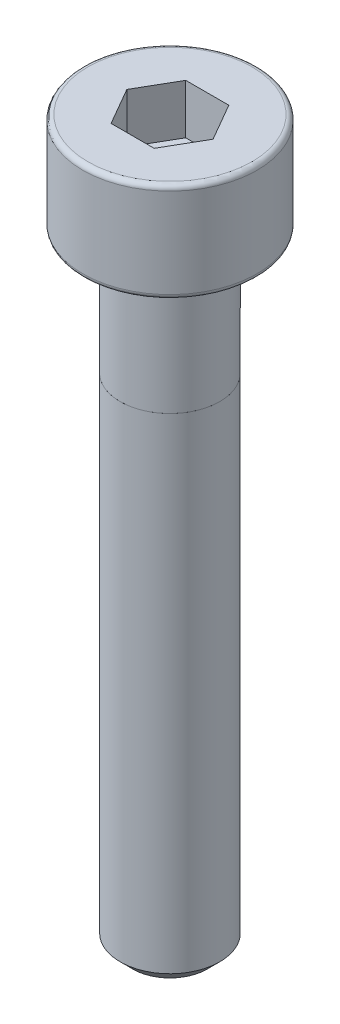
ISO-10303-21;
HEADER;
FILE_DESCRIPTION(('STEP AP214'),'2;1');
FILE_NAME('part.step','',(''),(''),'','','');
FILE_SCHEMA(('AUTOMOTIVE_DESIGN { 1 0 10303 214 1 1 1 1 }'));
ENDSEC;
DATA;
#1=APPLICATION_CONTEXT('core data for automotive mechanical design processes');
#2=APPLICATION_PROTOCOL_DEFINITION('international standard','automotive_design',2000,#1);
#3=PRODUCT_CONTEXT('',#1,'mechanical');
#4=PRODUCT('Part','Part','',(#3));
#5=PRODUCT_RELATED_PRODUCT_CATEGORY('part','',(#4));
#6=PRODUCT_DEFINITION_FORMATION('','',#4);
#7=PRODUCT_DEFINITION_CONTEXT('part definition',#1,'design');
#8=PRODUCT_DEFINITION('design','',#6,#7);
#9=PRODUCT_DEFINITION_SHAPE('','',#8);
#10=(LENGTH_UNIT() NAMED_UNIT(*) SI_UNIT(.MILLI.,.METRE.));
#11=(NAMED_UNIT(*) PLANE_ANGLE_UNIT() SI_UNIT($,.RADIAN.));
#12=(NAMED_UNIT(*) SI_UNIT($,.STERADIAN.) SOLID_ANGLE_UNIT());
#13=UNCERTAINTY_MEASURE_WITH_UNIT(LENGTH_MEASURE(1.E-05),#10,'distance_accuracy_value','');
#14=(GEOMETRIC_REPRESENTATION_CONTEXT(3) GLOBAL_UNCERTAINTY_ASSIGNED_CONTEXT((#13)) GLOBAL_UNIT_ASSIGNED_CONTEXT((#10,
#11,#12)) REPRESENTATION_CONTEXT('',''));
#15=CARTESIAN_POINT('',(0.,0.,0.));
#16=DIRECTION('',(0.,0.,1.));
#17=DIRECTION('',(1.,0.,0.));
#18=AXIS2_PLACEMENT_3D('',#15,#16,#17);
#19=CARTESIAN_POINT('',(0.,-29.,0.));
#20=DIRECTION('',(0.,1.,0.));
#21=DIRECTION('',(0.,0.,1.));
#22=AXIS2_PLACEMENT_3D('',#19,#20,#21);
#23=CYLINDRICAL_SURFACE('',#22,2.);
#24=CARTESIAN_POINT('',(0.,-28.5,0.));
#25=DIRECTION('',(0.,-1.,0.));
#26=DIRECTION('',(0.,0.,-1.));
#27=AXIS2_PLACEMENT_3D('',#24,#25,#26);
#28=CIRCLE('',#27,2.);
#29=CARTESIAN_POINT('',(0.,-28.5,-2.));
#30=VERTEX_POINT('',#29);
#31=EDGE_CURVE('E11',#30,#30,#28,.F.);
#32=ORIENTED_EDGE('',*,*,#31,.T.);
#33=EDGE_LOOP('',(#32));
#34=FACE_BOUND('',#33,.T.);
#35=CARTESIAN_POINT('',(0.,-9.,0.));
#36=DIRECTION('',(0.,-1.,0.));
#37=DIRECTION('',(0.,0.,-1.));
#38=AXIS2_PLACEMENT_3D('',#35,#36,#37);
#39=CIRCLE('',#38,2.);
#40=CARTESIAN_POINT('',(0.,-9.,-2.));
#41=VERTEX_POINT('',#40);
#42=EDGE_CURVE('E53',#41,#41,#39,.T.);
#43=ORIENTED_EDGE('',*,*,#42,.T.);
#44=EDGE_LOOP('',(#43));
#45=FACE_BOUND('',#44,.T.);
#46=ADVANCED_FACE('F42',(#34,#45),#23,.T.);
#47=CARTESIAN_POINT('',(0.,-29.,0.));
#48=DIRECTION('',(0.,-1.,0.));
#49=DIRECTION('',(0.,0.,-1.));
#50=AXIS2_PLACEMENT_3D('',#47,#48,#49);
#51=PLANE('',#50);
#52=CARTESIAN_POINT('',(0.,-29.,0.));
#53=DIRECTION('',(0.,-1.,0.));
#54=DIRECTION('',(0.,0.,-1.));
#55=AXIS2_PLACEMENT_3D('',#52,#53,#54);
#56=CIRCLE('',#55,1.5);
#57=CARTESIAN_POINT('',(0.,-29.,-1.5));
#58=VERTEX_POINT('',#57);
#59=EDGE_CURVE('E49',#58,#58,#56,.T.);
#60=ORIENTED_EDGE('',*,*,#59,.T.);
#61=EDGE_LOOP('',(#60));
#62=FACE_BOUND('',#61,.T.);
#63=ADVANCED_FACE('F63',(#62),#51,.T.);
#64=CARTESIAN_POINT('',(0.,-9.,0.));
#65=DIRECTION('',(0.,-1.,0.));
#66=DIRECTION('',(0.,0.,-1.));
#67=AXIS2_PLACEMENT_3D('',#64,#65,#66);
#68=PLANE('',#67);
#69=ORIENTED_EDGE('',*,*,#42,.F.);
#70=EDGE_LOOP('',(#69));
#71=FACE_BOUND('',#70,.T.);
#72=ADVANCED_FACE('F61',(#71),#68,.F.);
#73=CARTESIAN_POINT('',(0.,-29.,0.));
#74=DIRECTION('',(0.,1.,0.));
#75=DIRECTION('',(0.,0.,1.));
#76=AXIS2_PLACEMENT_3D('',#73,#74,#75);
#77=CONICAL_SURFACE('',#76,1.5,0.785398163397443);
#78=ORIENTED_EDGE('',*,*,#31,.F.);
#79=EDGE_LOOP('',(#78));
#80=FACE_BOUND('',#79,.T.);
#81=ORIENTED_EDGE('',*,*,#59,.F.);
#82=EDGE_LOOP('',(#81));
#83=FACE_BOUND('',#82,.T.);
#84=ADVANCED_FACE('F44',(#80,#83),#77,.T.);
#85=CLOSED_SHELL('',(#46,#63,#72,#84));
#86=MANIFOLD_SOLID_BREP('B2',#85);
#87=CARTESIAN_POINT('',(0.,-4.,0.));
#88=DIRECTION('',(0.,1.,0.));
#89=DIRECTION('',(0.,0.,1.));
#90=AXIS2_PLACEMENT_3D('',#87,#88,#89);
#91=CYLINDRICAL_SURFACE('',#90,3.5);
#92=CARTESIAN_POINT('',(0.,-3.8,0.));
#93=DIRECTION('',(0.,1.,0.));
#94=DIRECTION('',(0.,0.,1.));
#95=AXIS2_PLACEMENT_3D('',#92,#93,#94);
#96=CIRCLE('',#95,3.5);
#97=CARTESIAN_POINT('',(0.,-3.8,3.5));
#98=VERTEX_POINT('',#97);
#99=EDGE_CURVE('E217',#98,#98,#96,.T.);
#100=ORIENTED_EDGE('',*,*,#99,.T.);
#101=EDGE_LOOP('',(#100));
#102=FACE_BOUND('',#101,.T.);
#103=CARTESIAN_POINT('',(0.,-0.2,0.));
#104=DIRECTION('',(0.,1.,0.));
#105=DIRECTION('',(0.,0.,1.));
#106=AXIS2_PLACEMENT_3D('',#103,#104,#105);
#107=CIRCLE('',#106,3.5);
#108=CARTESIAN_POINT('',(0.,-0.2,3.5));
#109=VERTEX_POINT('',#108);
#110=EDGE_CURVE('E214',#109,#109,#107,.F.);
#111=ORIENTED_EDGE('',*,*,#110,.T.);
#112=EDGE_LOOP('',(#111));
#113=FACE_BOUND('',#112,.T.);
#114=ADVANCED_FACE('F103',(#102,#113),#91,.T.);
#115=CARTESIAN_POINT('',(0.,-4.,0.));
#116=DIRECTION('',(0.,1.,0.));
#117=DIRECTION('',(0.,0.,1.));
#118=AXIS2_PLACEMENT_3D('',#115,#116,#117);
#119=PLANE('',#118);
#120=CARTESIAN_POINT('',(0.,-4.,0.));
#121=DIRECTION('',(0.,1.,0.));
#122=DIRECTION('',(0.,0.,1.));
#123=AXIS2_PLACEMENT_3D('',#120,#121,#122);
#124=CIRCLE('',#123,3.3);
#125=CARTESIAN_POINT('',(0.,-4.,3.3));
#126=VERTEX_POINT('',#125);
#127=EDGE_CURVE('E111',#126,#126,#124,.F.);
#128=ORIENTED_EDGE('',*,*,#127,.T.);
#129=EDGE_LOOP('',(#128));
#130=FACE_BOUND('',#129,.T.);
#131=CARTESIAN_POINT('',(0.,-4.,0.));
#132=DIRECTION('',(0.,1.,0.));
#133=DIRECTION('',(0.,0.,1.));
#134=AXIS2_PLACEMENT_3D('',#131,#132,#133);
#135=CIRCLE('',#134,2.);
#136=CARTESIAN_POINT('',(0.,-4.,2.));
#137=VERTEX_POINT('',#136);
#138=EDGE_CURVE('E206',#137,#137,#135,.F.);
#139=ORIENTED_EDGE('',*,*,#138,.F.);
#140=EDGE_LOOP('',(#139));
#141=FACE_BOUND('',#140,.T.);
#142=ADVANCED_FACE('F222',(#130,#141),#119,.F.);
#143=CARTESIAN_POINT('',(0.,0.,0.));
#144=DIRECTION('',(0.,1.,0.));
#145=DIRECTION('',(0.,0.,1.));
#146=AXIS2_PLACEMENT_3D('',#143,#144,#145);
#147=PLANE('',#146);
#148=CARTESIAN_POINT('',(0.,0.,0.));
#149=DIRECTION('',(0.,1.,0.));
#150=DIRECTION('',(0.,0.,1.));
#151=AXIS2_PLACEMENT_3D('',#148,#149,#150);
#152=CIRCLE('',#151,3.3);
#153=CARTESIAN_POINT('',(0.,0.,3.3));
#154=VERTEX_POINT('',#153);
#155=EDGE_CURVE('E40',#154,#154,#152,.T.);
#156=ORIENTED_EDGE('',*,*,#155,.T.);
#157=EDGE_LOOP('',(#156));
#158=FACE_BOUND('',#157,.T.);
#159=DIRECTION('',(0.499999999999999,0.,-0.866025403784439));
#160=VECTOR('',#159,1.);
#161=CARTESIAN_POINT('',(0.866025403784439,0.,1.5));
#162=LINE('',#161,#160);
#163=CARTESIAN_POINT('',(0.866025403784439,0.,1.5));
#164=VERTEX_POINT('',#163);
#165=CARTESIAN_POINT('',(1.73205080756888,0.,0.));
#166=VERTEX_POINT('',#165);
#167=EDGE_CURVE('E118',#164,#166,#162,.T.);
#168=ORIENTED_EDGE('',*,*,#167,.F.);
#169=DIRECTION('',(1.,0.,0.));
#170=VECTOR('',#169,1.);
#171=CARTESIAN_POINT('',(-0.866025403784439,0.,1.5));
#172=LINE('',#171,#170);
#173=CARTESIAN_POINT('',(-0.866025403784439,0.,1.5));
#174=VERTEX_POINT('',#173);
#175=EDGE_CURVE('E202',#174,#164,#172,.T.);
#176=ORIENTED_EDGE('',*,*,#175,.F.);
#177=DIRECTION('',(0.5,0.,0.866025403784438));
#178=VECTOR('',#177,1.);
#179=CARTESIAN_POINT('',(-1.73205080756888,0.,0.));
#180=LINE('',#179,#178);
#181=CARTESIAN_POINT('',(-1.73205080756888,0.,0.));
#182=VERTEX_POINT('',#181);
#183=EDGE_CURVE('E200',#182,#174,#180,.T.);
#184=ORIENTED_EDGE('',*,*,#183,.F.);
#185=DIRECTION('',(-0.499999999999999,0.,0.866025403784439));
#186=VECTOR('',#185,1.);
#187=CARTESIAN_POINT('',(-0.86602540378444,0.,-1.5));
#188=LINE('',#187,#186);
#189=CARTESIAN_POINT('',(-0.86602540378444,0.,-1.5));
#190=VERTEX_POINT('',#189);
#191=EDGE_CURVE('E166',#190,#182,#188,.T.);
#192=ORIENTED_EDGE('',*,*,#191,.F.);
#193=DIRECTION('',(-1.,0.,0.));
#194=VECTOR('',#193,1.);
#195=CARTESIAN_POINT('',(0.866025403784438,0.,-1.5));
#196=LINE('',#195,#194);
#197=CARTESIAN_POINT('',(0.866025403784438,0.,-1.5));
#198=VERTEX_POINT('',#197);
#199=EDGE_CURVE('E196',#198,#190,#196,.T.);
#200=ORIENTED_EDGE('',*,*,#199,.F.);
#201=DIRECTION('',(-0.5,0.,-0.866025403784438));
#202=VECTOR('',#201,1.);
#203=CARTESIAN_POINT('',(1.73205080756888,0.,0.));
#204=LINE('',#203,#202);
#205=EDGE_CURVE('E192',#166,#198,#204,.T.);
#206=ORIENTED_EDGE('',*,*,#205,.F.);
#207=EDGE_LOOP('',(#168,#176,#184,#192,#200,#206));
#208=FACE_BOUND('',#207,.T.);
#209=ADVANCED_FACE('F240',(#158,#208),#147,.T.);
#210=CARTESIAN_POINT('',(0.866025403784439,-2.,1.5));
#211=DIRECTION('',(0.866025403784439,0.,0.499999999999999));
#212=DIRECTION('',(0.499999999999999,0.,-0.866025403784439));
#213=AXIS2_PLACEMENT_3D('',#210,#211,#212);
#214=PLANE('',#213);
#215=ORIENTED_EDGE('',*,*,#167,.T.);
#216=DIRECTION('',(0.,1.,0.));
#217=VECTOR('',#216,1.);
#218=CARTESIAN_POINT('',(1.73205080756888,-2.,0.));
#219=LINE('',#218,#217);
#220=CARTESIAN_POINT('',(1.73205080756888,-2.,0.));
#221=VERTEX_POINT('',#220);
#222=EDGE_CURVE('E148',#221,#166,#219,.T.);
#223=ORIENTED_EDGE('',*,*,#222,.F.);
#224=DIRECTION('',(0.499999999999999,0.,-0.866025403784439));
#225=VECTOR('',#224,1.);
#226=CARTESIAN_POINT('',(0.866025403784439,-2.,1.5));
#227=LINE('',#226,#225);
#228=CARTESIAN_POINT('',(0.866025403784439,-2.,1.5));
#229=VERTEX_POINT('',#228);
#230=EDGE_CURVE('E204',#229,#221,#227,.T.);
#231=ORIENTED_EDGE('',*,*,#230,.F.);
#232=DIRECTION('',(0.,1.,0.));
#233=VECTOR('',#232,1.);
#234=CARTESIAN_POINT('',(0.866025403784439,-2.,1.5));
#235=LINE('',#234,#233);
#236=EDGE_CURVE('E126',#229,#164,#235,.T.);
#237=ORIENTED_EDGE('',*,*,#236,.T.);
#238=EDGE_LOOP('',(#215,#223,#231,#237));
#239=FACE_BOUND('',#238,.T.);
#240=ADVANCED_FACE('F243',(#239),#214,.F.);
#241=CARTESIAN_POINT('',(-0.866025403784439,-2.,1.5));
#242=DIRECTION('',(0.,0.,1.));
#243=DIRECTION('',(1.,0.,0.));
#244=AXIS2_PLACEMENT_3D('',#241,#242,#243);
#245=PLANE('',#244);
#246=ORIENTED_EDGE('',*,*,#175,.T.);
#247=ORIENTED_EDGE('',*,*,#236,.F.);
#248=DIRECTION('',(1.,0.,0.));
#249=VECTOR('',#248,1.);
#250=CARTESIAN_POINT('',(-0.866025403784439,-2.,1.5));
#251=LINE('',#250,#249);
#252=CARTESIAN_POINT('',(-0.866025403784439,-2.,1.5));
#253=VERTEX_POINT('',#252);
#254=EDGE_CURVE('E178',#253,#229,#251,.T.);
#255=ORIENTED_EDGE('',*,*,#254,.F.);
#256=DIRECTION('',(0.,1.,0.));
#257=VECTOR('',#256,1.);
#258=CARTESIAN_POINT('',(-0.866025403784439,-2.,1.5));
#259=LINE('',#258,#257);
#260=EDGE_CURVE('E170',#253,#174,#259,.T.);
#261=ORIENTED_EDGE('',*,*,#260,.T.);
#262=EDGE_LOOP('',(#246,#247,#255,#261));
#263=FACE_BOUND('',#262,.T.);
#264=ADVANCED_FACE('F268',(#263),#245,.F.);
#265=CARTESIAN_POINT('',(-1.73205080756888,-2.,0.));
#266=DIRECTION('',(-0.866025403784439,0.,0.5));
#267=DIRECTION('',(0.5,0.,0.866025403784438));
#268=AXIS2_PLACEMENT_3D('',#265,#266,#267);
#269=PLANE('',#268);
#270=ORIENTED_EDGE('',*,*,#183,.T.);
#271=ORIENTED_EDGE('',*,*,#260,.F.);
#272=DIRECTION('',(0.5,0.,0.866025403784438));
#273=VECTOR('',#272,1.);
#274=CARTESIAN_POINT('',(-1.73205080756888,-2.,0.));
#275=LINE('',#274,#273);
#276=CARTESIAN_POINT('',(-1.73205080756888,-2.,0.));
#277=VERTEX_POINT('',#276);
#278=EDGE_CURVE('E174',#277,#253,#275,.T.);
#279=ORIENTED_EDGE('',*,*,#278,.F.);
#280=DIRECTION('',(0.,1.,0.));
#281=VECTOR('',#280,1.);
#282=CARTESIAN_POINT('',(-1.73205080756888,-2.,0.));
#283=LINE('',#282,#281);
#284=EDGE_CURVE('E159',#277,#182,#283,.T.);
#285=ORIENTED_EDGE('',*,*,#284,.T.);
#286=EDGE_LOOP('',(#270,#271,#279,#285));
#287=FACE_BOUND('',#286,.T.);
#288=ADVANCED_FACE('F175',(#287),#269,.F.);
#289=CARTESIAN_POINT('',(-0.86602540378444,-2.,-1.5));
#290=DIRECTION('',(-0.866025403784439,0.,-0.5));
#291=DIRECTION('',(-0.5,0.,0.866025403784439));
#292=AXIS2_PLACEMENT_3D('',#289,#290,#291);
#293=PLANE('',#292);
#294=ORIENTED_EDGE('',*,*,#191,.T.);
#295=ORIENTED_EDGE('',*,*,#284,.F.);
#296=DIRECTION('',(-0.499999999999999,0.,0.866025403784439));
#297=VECTOR('',#296,1.);
#298=CARTESIAN_POINT('',(-0.86602540378444,-2.,-1.5));
#299=LINE('',#298,#297);
#300=CARTESIAN_POINT('',(-0.86602540378444,-2.,-1.5));
#301=VERTEX_POINT('',#300);
#302=EDGE_CURVE('E163',#301,#277,#299,.T.);
#303=ORIENTED_EDGE('',*,*,#302,.F.);
#304=DIRECTION('',(0.,1.,0.));
#305=VECTOR('',#304,1.);
#306=CARTESIAN_POINT('',(-0.86602540378444,-2.,-1.5));
#307=LINE('',#306,#305);
#308=EDGE_CURVE('E171',#301,#190,#307,.T.);
#309=ORIENTED_EDGE('',*,*,#308,.T.);
#310=EDGE_LOOP('',(#294,#295,#303,#309));
#311=FACE_BOUND('',#310,.T.);
#312=ADVANCED_FACE('F161',(#311),#293,.F.);
#313=CARTESIAN_POINT('',(0.866025403784438,-2.,-1.5));
#314=DIRECTION('',(0.,0.,-1.));
#315=DIRECTION('',(-1.,0.,0.));
#316=AXIS2_PLACEMENT_3D('',#313,#314,#315);
#317=PLANE('',#316);
#318=ORIENTED_EDGE('',*,*,#199,.T.);
#319=ORIENTED_EDGE('',*,*,#308,.F.);
#320=DIRECTION('',(-1.,0.,0.));
#321=VECTOR('',#320,1.);
#322=CARTESIAN_POINT('',(0.866025403784438,-2.,-1.5));
#323=LINE('',#322,#321);
#324=CARTESIAN_POINT('',(0.866025403784438,-2.,-1.5));
#325=VERTEX_POINT('',#324);
#326=EDGE_CURVE('E184',#325,#301,#323,.T.);
#327=ORIENTED_EDGE('',*,*,#326,.F.);
#328=DIRECTION('',(0.,1.,0.));
#329=VECTOR('',#328,1.);
#330=CARTESIAN_POINT('',(0.866025403784438,-2.,-1.5));
#331=LINE('',#330,#329);
#332=EDGE_CURVE('E209',#325,#198,#331,.T.);
#333=ORIENTED_EDGE('',*,*,#332,.T.);
#334=EDGE_LOOP('',(#318,#319,#327,#333));
#335=FACE_BOUND('',#334,.T.);
#336=ADVANCED_FACE('F271',(#335),#317,.F.);
#337=CARTESIAN_POINT('',(1.73205080756888,-2.,0.));
#338=DIRECTION('',(0.866025403784438,0.,-0.5));
#339=DIRECTION('',(-0.5,0.,-0.866025403784438));
#340=AXIS2_PLACEMENT_3D('',#337,#338,#339);
#341=PLANE('',#340);
#342=ORIENTED_EDGE('',*,*,#205,.T.);
#343=ORIENTED_EDGE('',*,*,#332,.F.);
#344=DIRECTION('',(-0.5,0.,-0.866025403784438));
#345=VECTOR('',#344,1.);
#346=CARTESIAN_POINT('',(1.73205080756888,-2.,0.));
#347=LINE('',#346,#345);
#348=EDGE_CURVE('E186',#221,#325,#347,.T.);
#349=ORIENTED_EDGE('',*,*,#348,.F.);
#350=ORIENTED_EDGE('',*,*,#222,.T.);
#351=EDGE_LOOP('',(#342,#343,#349,#350));
#352=FACE_BOUND('',#351,.T.);
#353=ADVANCED_FACE('F249',(#352),#341,.F.);
#354=CARTESIAN_POINT('',(0.,-2.,0.));
#355=DIRECTION('',(0.,1.,0.));
#356=DIRECTION('',(0.,0.,1.));
#357=AXIS2_PLACEMENT_3D('',#354,#355,#356);
#358=PLANE('',#357);
#359=ORIENTED_EDGE('',*,*,#230,.T.);
#360=ORIENTED_EDGE('',*,*,#348,.T.);
#361=ORIENTED_EDGE('',*,*,#326,.T.);
#362=ORIENTED_EDGE('',*,*,#302,.T.);
#363=ORIENTED_EDGE('',*,*,#278,.T.);
#364=ORIENTED_EDGE('',*,*,#254,.T.);
#365=EDGE_LOOP('',(#359,#360,#361,#362,#363,#364));
#366=FACE_BOUND('',#365,.T.);
#367=ADVANCED_FACE('F181',(#366),#358,.T.);
#368=CARTESIAN_POINT('',(0.,-9.,0.));
#369=DIRECTION('',(0.,1.,0.));
#370=DIRECTION('',(0.,0.,1.));
#371=AXIS2_PLACEMENT_3D('',#368,#369,#370);
#372=CYLINDRICAL_SURFACE('',#371,2.);
#373=CARTESIAN_POINT('',(0.,-9.,0.));
#374=DIRECTION('',(0.,-1.,0.));
#375=DIRECTION('',(0.,0.,-1.));
#376=AXIS2_PLACEMENT_3D('',#373,#374,#375);
#377=CIRCLE('',#376,2.);
#378=CARTESIAN_POINT('',(0.,-9.,-2.));
#379=VERTEX_POINT('',#378);
#380=EDGE_CURVE('E193',#379,#379,#377,.T.);
#381=ORIENTED_EDGE('',*,*,#380,.F.);
#382=EDGE_LOOP('',(#381));
#383=FACE_BOUND('',#382,.T.);
#384=ORIENTED_EDGE('',*,*,#138,.T.);
#385=EDGE_LOOP('',(#384));
#386=FACE_BOUND('',#385,.T.);
#387=ADVANCED_FACE('F256',(#383,#386),#372,.T.);
#388=CARTESIAN_POINT('',(0.,-9.,0.));
#389=DIRECTION('',(0.,-1.,0.));
#390=DIRECTION('',(0.,0.,-1.));
#391=AXIS2_PLACEMENT_3D('',#388,#389,#390);
#392=PLANE('',#391);
#393=ORIENTED_EDGE('',*,*,#380,.T.);
#394=EDGE_LOOP('',(#393));
#395=FACE_BOUND('',#394,.T.);
#396=ADVANCED_FACE('F228',(#395),#392,.T.);
#397=CARTESIAN_POINT('',(0.,-3.8,0.));
#398=DIRECTION('',(0.,1.,0.));
#399=DIRECTION('',(0.,0.,1.));
#400=AXIS2_PLACEMENT_3D('',#397,#398,#399);
#401=TOROIDAL_SURFACE('',#400,3.3,0.2);
#402=ORIENTED_EDGE('',*,*,#127,.F.);
#403=EDGE_LOOP('',(#402));
#404=FACE_BOUND('',#403,.T.);
#405=ORIENTED_EDGE('',*,*,#99,.F.);
#406=EDGE_LOOP('',(#405));
#407=FACE_BOUND('',#406,.T.);
#408=ADVANCED_FACE('F225',(#404,#407),#401,.T.);
#409=CARTESIAN_POINT('',(0.,-0.2,0.));
#410=DIRECTION('',(0.,1.,0.));
#411=DIRECTION('',(0.,0.,1.));
#412=AXIS2_PLACEMENT_3D('',#409,#410,#411);
#413=TOROIDAL_SURFACE('',#412,3.3,0.2);
#414=ORIENTED_EDGE('',*,*,#110,.F.);
#415=EDGE_LOOP('',(#414));
#416=FACE_BOUND('',#415,.T.);
#417=ORIENTED_EDGE('',*,*,#155,.F.);
#418=EDGE_LOOP('',(#417));
#419=FACE_BOUND('',#418,.T.);
#420=ADVANCED_FACE('F105',(#416,#419),#413,.T.);
#421=CLOSED_SHELL('',(#114,#142,#209,#240,#264,#288,#312,#336,#353,#367,#387,#396,#408,#420));
#422=MANIFOLD_SOLID_BREP('B6',#421);
#423=ADVANCED_BREP_SHAPE_REPRESENTATION('',(#18,#86,#422),#14);
#424=SHAPE_DEFINITION_REPRESENTATION(#9,#423);
ENDSEC;
END-ISO-10303-21;
